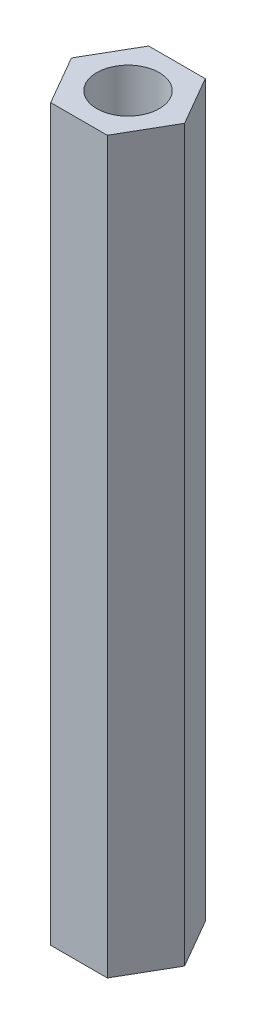
ISO-10303-21;
HEADER;
FILE_DESCRIPTION(('STEP AP214'),'2;1');
FILE_NAME('part.step','',(''),(''),'','','');
FILE_SCHEMA(('AUTOMOTIVE_DESIGN { 1 0 10303 214 1 1 1 1 }'));
ENDSEC;
DATA;
#1=APPLICATION_CONTEXT('core data for automotive mechanical design processes');
#2=APPLICATION_PROTOCOL_DEFINITION('international standard','automotive_design',2000,#1);
#3=PRODUCT_CONTEXT('',#1,'mechanical');
#4=PRODUCT('Part','Part','',(#3));
#5=PRODUCT_RELATED_PRODUCT_CATEGORY('part','',(#4));
#6=PRODUCT_DEFINITION_FORMATION('','',#4);
#7=PRODUCT_DEFINITION_CONTEXT('part definition',#1,'design');
#8=PRODUCT_DEFINITION('design','',#6,#7);
#9=PRODUCT_DEFINITION_SHAPE('','',#8);
#10=(LENGTH_UNIT() NAMED_UNIT(*) SI_UNIT(.MILLI.,.METRE.));
#11=(NAMED_UNIT(*) PLANE_ANGLE_UNIT() SI_UNIT($,.RADIAN.));
#12=(NAMED_UNIT(*) SI_UNIT($,.STERADIAN.) SOLID_ANGLE_UNIT());
#13=UNCERTAINTY_MEASURE_WITH_UNIT(LENGTH_MEASURE(1.E-05),#10,'distance_accuracy_value','');
#14=(GEOMETRIC_REPRESENTATION_CONTEXT(3) GLOBAL_UNCERTAINTY_ASSIGNED_CONTEXT((#13)) GLOBAL_UNIT_ASSIGNED_CONTEXT((#10,
#11,#12)) REPRESENTATION_CONTEXT('',''));
#15=CARTESIAN_POINT('',(0.,0.,0.));
#16=DIRECTION('',(0.,0.,1.));
#17=DIRECTION('',(1.,0.,0.));
#18=AXIS2_PLACEMENT_3D('',#15,#16,#17);
#19=CARTESIAN_POINT('',(0.,35.,0.));
#20=DIRECTION('',(0.,1.,0.));
#21=DIRECTION('',(0.,0.,1.));
#22=AXIS2_PLACEMENT_3D('',#19,#20,#21);
#23=PLANE('',#22);
#24=DIRECTION('',(0.5,0.,-0.866025403784439));
#25=VECTOR('',#24,1.);
#26=CARTESIAN_POINT('',(1.35677313259562,35.,2.35));
#27=LINE('',#26,#25);
#28=CARTESIAN_POINT('',(1.35677313259562,35.,2.35));
#29=VERTEX_POINT('',#28);
#30=CARTESIAN_POINT('',(2.71354626519124,35.,0.));
#31=VERTEX_POINT('',#30);
#32=EDGE_CURVE('E129',#29,#31,#27,.T.);
#33=ORIENTED_EDGE('',*,*,#32,.T.);
#34=DIRECTION('',(-0.5,0.,-0.866025403784439));
#35=VECTOR('',#34,1.);
#36=CARTESIAN_POINT('',(2.71354626519124,35.,0.));
#37=LINE('',#36,#35);
#38=CARTESIAN_POINT('',(1.35677313259562,35.,-2.35));
#39=VERTEX_POINT('',#38);
#40=EDGE_CURVE('E87',#31,#39,#37,.T.);
#41=ORIENTED_EDGE('',*,*,#40,.T.);
#42=DIRECTION('',(-1.,0.,0.));
#43=VECTOR('',#42,1.);
#44=CARTESIAN_POINT('',(1.35677313259562,35.,-2.35));
#45=LINE('',#44,#43);
#46=CARTESIAN_POINT('',(-1.35677313259562,35.,-2.35));
#47=VERTEX_POINT('',#46);
#48=EDGE_CURVE('E100',#39,#47,#45,.T.);
#49=ORIENTED_EDGE('',*,*,#48,.T.);
#50=DIRECTION('',(-0.5,0.,0.866025403784439));
#51=VECTOR('',#50,1.);
#52=CARTESIAN_POINT('',(-1.35677313259562,35.,-2.35));
#53=LINE('',#52,#51);
#54=CARTESIAN_POINT('',(-2.71354626519124,35.,0.));
#55=VERTEX_POINT('',#54);
#56=EDGE_CURVE('E94',#47,#55,#53,.T.);
#57=ORIENTED_EDGE('',*,*,#56,.T.);
#58=DIRECTION('',(0.5,0.,0.866025403784439));
#59=VECTOR('',#58,1.);
#60=CARTESIAN_POINT('',(-2.71354626519124,35.,0.));
#61=LINE('',#60,#59);
#62=CARTESIAN_POINT('',(-1.35677313259562,35.,2.35));
#63=VERTEX_POINT('',#62);
#64=EDGE_CURVE('E98',#55,#63,#61,.T.);
#65=ORIENTED_EDGE('',*,*,#64,.T.);
#66=DIRECTION('',(1.,0.,0.));
#67=VECTOR('',#66,1.);
#68=CARTESIAN_POINT('',(-1.35677313259562,35.,2.35));
#69=LINE('',#68,#67);
#70=EDGE_CURVE('E50',#63,#29,#69,.T.);
#71=ORIENTED_EDGE('',*,*,#70,.T.);
#72=EDGE_LOOP('',(#33,#41,#49,#57,#65,#71));
#73=FACE_BOUND('',#72,.T.);
#74=CARTESIAN_POINT('',(0.,35.,0.));
#75=DIRECTION('',(0.,1.,0.));
#76=DIRECTION('',(0.,0.,1.));
#77=AXIS2_PLACEMENT_3D('',#74,#75,#76);
#78=CIRCLE('',#77,1.5);
#79=CARTESIAN_POINT('',(0.,35.,1.5));
#80=VERTEX_POINT('',#79);
#81=EDGE_CURVE('E122',#80,#80,#78,.T.);
#82=ORIENTED_EDGE('',*,*,#81,.F.);
#83=EDGE_LOOP('',(#82));
#84=FACE_BOUND('',#83,.T.);
#85=ADVANCED_FACE('F33',(#73,#84),#23,.T.);
#86=CARTESIAN_POINT('',(0.,0.,0.));
#87=DIRECTION('',(0.,1.,0.));
#88=DIRECTION('',(0.,0.,1.));
#89=AXIS2_PLACEMENT_3D('',#86,#87,#88);
#90=PLANE('',#89);
#91=DIRECTION('',(0.5,0.,-0.866025403784439));
#92=VECTOR('',#91,1.);
#93=CARTESIAN_POINT('',(1.35677313259562,0.,2.35));
#94=LINE('',#93,#92);
#95=CARTESIAN_POINT('',(1.35677313259562,0.,2.35));
#96=VERTEX_POINT('',#95);
#97=CARTESIAN_POINT('',(2.71354626519124,0.,0.));
#98=VERTEX_POINT('',#97);
#99=EDGE_CURVE('E118',#96,#98,#94,.T.);
#100=ORIENTED_EDGE('',*,*,#99,.F.);
#101=DIRECTION('',(1.,0.,0.));
#102=VECTOR('',#101,1.);
#103=CARTESIAN_POINT('',(-1.35677313259562,0.,2.35));
#104=LINE('',#103,#102);
#105=CARTESIAN_POINT('',(-1.35677313259562,0.,2.35));
#106=VERTEX_POINT('',#105);
#107=EDGE_CURVE('E79',#106,#96,#104,.T.);
#108=ORIENTED_EDGE('',*,*,#107,.F.);
#109=DIRECTION('',(0.5,0.,0.866025403784439));
#110=VECTOR('',#109,1.);
#111=CARTESIAN_POINT('',(-2.71354626519124,0.,0.));
#112=LINE('',#111,#110);
#113=CARTESIAN_POINT('',(-2.71354626519124,0.,0.));
#114=VERTEX_POINT('',#113);
#115=EDGE_CURVE('E73',#114,#106,#112,.T.);
#116=ORIENTED_EDGE('',*,*,#115,.F.);
#117=DIRECTION('',(-0.5,0.,0.866025403784439));
#118=VECTOR('',#117,1.);
#119=CARTESIAN_POINT('',(-1.35677313259562,0.,-2.35));
#120=LINE('',#119,#118);
#121=CARTESIAN_POINT('',(-1.35677313259562,0.,-2.35));
#122=VERTEX_POINT('',#121);
#123=EDGE_CURVE('E108',#122,#114,#120,.T.);
#124=ORIENTED_EDGE('',*,*,#123,.F.);
#125=DIRECTION('',(-1.,0.,0.));
#126=VECTOR('',#125,1.);
#127=CARTESIAN_POINT('',(1.35677313259562,0.,-2.35));
#128=LINE('',#127,#126);
#129=CARTESIAN_POINT('',(1.35677313259562,0.,-2.35));
#130=VERTEX_POINT('',#129);
#131=EDGE_CURVE('E124',#130,#122,#128,.T.);
#132=ORIENTED_EDGE('',*,*,#131,.F.);
#133=DIRECTION('',(-0.5,0.,-0.866025403784439));
#134=VECTOR('',#133,1.);
#135=CARTESIAN_POINT('',(2.71354626519124,0.,0.));
#136=LINE('',#135,#134);
#137=EDGE_CURVE('E121',#98,#130,#136,.T.);
#138=ORIENTED_EDGE('',*,*,#137,.F.);
#139=EDGE_LOOP('',(#100,#108,#116,#124,#132,#138));
#140=FACE_BOUND('',#139,.T.);
#141=CARTESIAN_POINT('',(0.,0.,0.));
#142=DIRECTION('',(0.,1.,0.));
#143=DIRECTION('',(0.,0.,1.));
#144=AXIS2_PLACEMENT_3D('',#141,#142,#143);
#145=CIRCLE('',#144,1.5);
#146=CARTESIAN_POINT('',(0.,0.,1.5));
#147=VERTEX_POINT('',#146);
#148=EDGE_CURVE('E222',#147,#147,#145,.T.);
#149=ORIENTED_EDGE('',*,*,#148,.T.);
#150=EDGE_LOOP('',(#149));
#151=FACE_BOUND('',#150,.T.);
#152=ADVANCED_FACE('F138',(#140,#151),#90,.F.);
#153=CARTESIAN_POINT('',(1.35677313259562,35.,2.35));
#154=DIRECTION('',(-0.866025403784439,0.,-0.5));
#155=DIRECTION('',(-0.5,0.,0.866025403784439));
#156=AXIS2_PLACEMENT_3D('',#153,#154,#155);
#157=PLANE('',#156);
#158=ORIENTED_EDGE('',*,*,#99,.T.);
#159=DIRECTION('',(0.,-1.,0.));
#160=VECTOR('',#159,1.);
#161=CARTESIAN_POINT('',(2.71354626519124,35.,0.));
#162=LINE('',#161,#160);
#163=EDGE_CURVE('E11',#31,#98,#162,.T.);
#164=ORIENTED_EDGE('',*,*,#163,.F.);
#165=ORIENTED_EDGE('',*,*,#32,.F.);
#166=DIRECTION('',(0.,-1.,0.));
#167=VECTOR('',#166,1.);
#168=CARTESIAN_POINT('',(1.35677313259562,35.,2.35));
#169=LINE('',#168,#167);
#170=EDGE_CURVE('E114',#29,#96,#169,.T.);
#171=ORIENTED_EDGE('',*,*,#170,.T.);
#172=EDGE_LOOP('',(#158,#164,#165,#171));
#173=FACE_BOUND('',#172,.T.);
#174=ADVANCED_FACE('F35',(#173),#157,.F.);
#175=CARTESIAN_POINT('',(2.71354626519124,35.,0.));
#176=DIRECTION('',(-0.866025403784439,0.,0.5));
#177=DIRECTION('',(0.5,0.,0.866025403784439));
#178=AXIS2_PLACEMENT_3D('',#175,#176,#177);
#179=PLANE('',#178);
#180=ORIENTED_EDGE('',*,*,#137,.T.);
#181=DIRECTION('',(0.,-1.,0.));
#182=VECTOR('',#181,1.);
#183=CARTESIAN_POINT('',(1.35677313259562,35.,-2.35));
#184=LINE('',#183,#182);
#185=EDGE_CURVE('E42',#39,#130,#184,.T.);
#186=ORIENTED_EDGE('',*,*,#185,.F.);
#187=ORIENTED_EDGE('',*,*,#40,.F.);
#188=ORIENTED_EDGE('',*,*,#163,.T.);
#189=EDGE_LOOP('',(#180,#186,#187,#188));
#190=FACE_BOUND('',#189,.T.);
#191=ADVANCED_FACE('F163',(#190),#179,.F.);
#192=CARTESIAN_POINT('',(1.35677313259562,35.,-2.35));
#193=DIRECTION('',(0.,0.,1.));
#194=DIRECTION('',(1.,0.,0.));
#195=AXIS2_PLACEMENT_3D('',#192,#193,#194);
#196=PLANE('',#195);
#197=ORIENTED_EDGE('',*,*,#131,.T.);
#198=DIRECTION('',(0.,-1.,0.));
#199=VECTOR('',#198,1.);
#200=CARTESIAN_POINT('',(-1.35677313259562,35.,-2.35));
#201=LINE('',#200,#199);
#202=EDGE_CURVE('E109',#47,#122,#201,.T.);
#203=ORIENTED_EDGE('',*,*,#202,.F.);
#204=ORIENTED_EDGE('',*,*,#48,.F.);
#205=ORIENTED_EDGE('',*,*,#185,.T.);
#206=EDGE_LOOP('',(#197,#203,#204,#205));
#207=FACE_BOUND('',#206,.T.);
#208=ADVANCED_FACE('F135',(#207),#196,.F.);
#209=CARTESIAN_POINT('',(-1.35677313259562,35.,-2.35));
#210=DIRECTION('',(0.866025403784439,0.,0.5));
#211=DIRECTION('',(0.5,0.,-0.866025403784439));
#212=AXIS2_PLACEMENT_3D('',#209,#210,#211);
#213=PLANE('',#212);
#214=ORIENTED_EDGE('',*,*,#123,.T.);
#215=DIRECTION('',(0.,-1.,0.));
#216=VECTOR('',#215,1.);
#217=CARTESIAN_POINT('',(-2.71354626519124,35.,0.));
#218=LINE('',#217,#216);
#219=EDGE_CURVE('E105',#55,#114,#218,.T.);
#220=ORIENTED_EDGE('',*,*,#219,.F.);
#221=ORIENTED_EDGE('',*,*,#56,.F.);
#222=ORIENTED_EDGE('',*,*,#202,.T.);
#223=EDGE_LOOP('',(#214,#220,#221,#222));
#224=FACE_BOUND('',#223,.T.);
#225=ADVANCED_FACE('F106',(#224),#213,.F.);
#226=CARTESIAN_POINT('',(-2.71354626519124,35.,0.));
#227=DIRECTION('',(0.866025403784439,0.,-0.5));
#228=DIRECTION('',(-0.5,0.,-0.866025403784439));
#229=AXIS2_PLACEMENT_3D('',#226,#227,#228);
#230=PLANE('',#229);
#231=ORIENTED_EDGE('',*,*,#115,.T.);
#232=DIRECTION('',(0.,-1.,0.));
#233=VECTOR('',#232,1.);
#234=CARTESIAN_POINT('',(-1.35677313259562,35.,2.35));
#235=LINE('',#234,#233);
#236=EDGE_CURVE('E110',#63,#106,#235,.T.);
#237=ORIENTED_EDGE('',*,*,#236,.F.);
#238=ORIENTED_EDGE('',*,*,#64,.F.);
#239=ORIENTED_EDGE('',*,*,#219,.T.);
#240=EDGE_LOOP('',(#231,#237,#238,#239));
#241=FACE_BOUND('',#240,.T.);
#242=ADVANCED_FACE('F112',(#241),#230,.F.);
#243=CARTESIAN_POINT('',(-1.35677313259562,35.,2.35));
#244=DIRECTION('',(0.,0.,-1.));
#245=DIRECTION('',(-1.,0.,0.));
#246=AXIS2_PLACEMENT_3D('',#243,#244,#245);
#247=PLANE('',#246);
#248=ORIENTED_EDGE('',*,*,#107,.T.);
#249=ORIENTED_EDGE('',*,*,#170,.F.);
#250=ORIENTED_EDGE('',*,*,#70,.F.);
#251=ORIENTED_EDGE('',*,*,#236,.T.);
#252=EDGE_LOOP('',(#248,#249,#250,#251));
#253=FACE_BOUND('',#252,.T.);
#254=ADVANCED_FACE('F143',(#253),#247,.F.);
#255=CARTESIAN_POINT('',(0.,35.,0.));
#256=DIRECTION('',(0.,-1.,0.));
#257=DIRECTION('',(0.,0.,-1.));
#258=AXIS2_PLACEMENT_3D('',#255,#256,#257);
#259=CYLINDRICAL_SURFACE('',#258,1.5);
#260=ORIENTED_EDGE('',*,*,#81,.T.);
#261=EDGE_LOOP('',(#260));
#262=FACE_BOUND('',#261,.T.);
#263=ORIENTED_EDGE('',*,*,#148,.F.);
#264=EDGE_LOOP('',(#263));
#265=FACE_BOUND('',#264,.T.);
#266=ADVANCED_FACE('F145',(#262,#265),#259,.F.);
#267=CLOSED_SHELL('',(#85,#152,#174,#191,#208,#225,#242,#254,#266));
#268=MANIFOLD_SOLID_BREP('B2',#267);
#269=ADVANCED_BREP_SHAPE_REPRESENTATION('',(#18,#268),#14);
#270=SHAPE_DEFINITION_REPRESENTATION(#9,#269);
ENDSEC;
END-ISO-10303-21;
